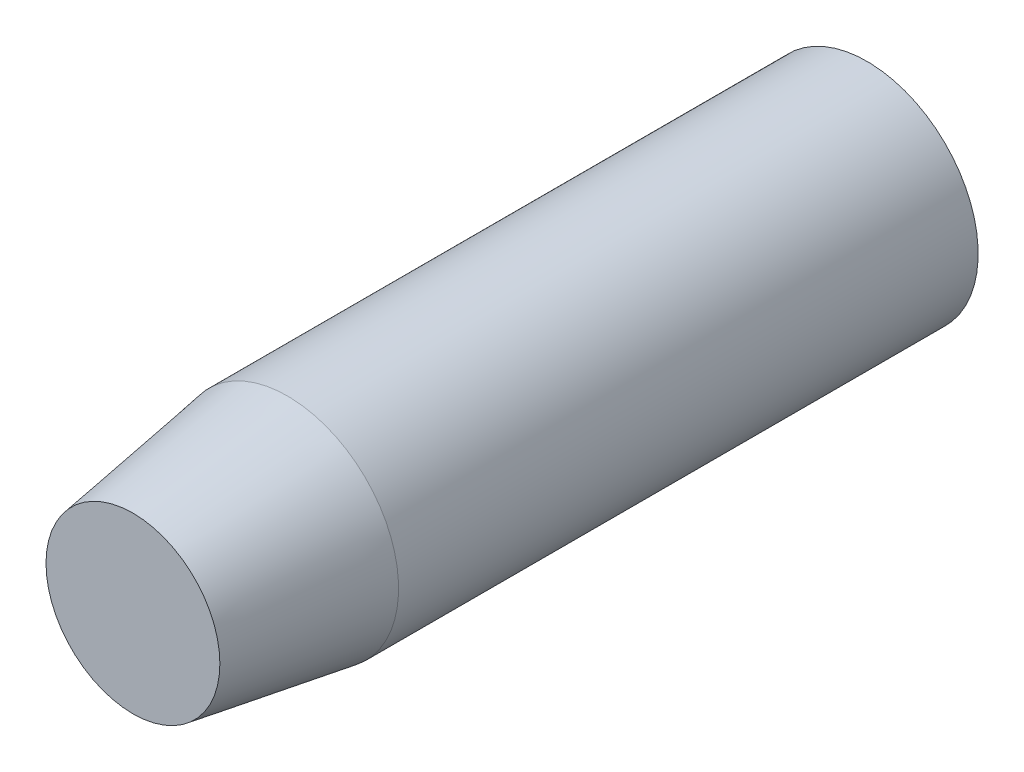
ISO-10303-21;
HEADER;
FILE_DESCRIPTION(('STEP AP214'),'2;1');
FILE_NAME('part.step','',(''),(''),'','','');
FILE_SCHEMA(('AUTOMOTIVE_DESIGN { 1 0 10303 214 1 1 1 1 }'));
ENDSEC;
DATA;
#1=APPLICATION_CONTEXT('core data for automotive mechanical design processes');
#2=APPLICATION_PROTOCOL_DEFINITION('international standard','automotive_design',2000,#1);
#3=PRODUCT_CONTEXT('',#1,'mechanical');
#4=PRODUCT('Part','Part','',(#3));
#5=PRODUCT_RELATED_PRODUCT_CATEGORY('part','',(#4));
#6=PRODUCT_DEFINITION_FORMATION('','',#4);
#7=PRODUCT_DEFINITION_CONTEXT('part definition',#1,'design');
#8=PRODUCT_DEFINITION('design','',#6,#7);
#9=PRODUCT_DEFINITION_SHAPE('','',#8);
#10=(LENGTH_UNIT() NAMED_UNIT(*) SI_UNIT(.MILLI.,.METRE.));
#11=(NAMED_UNIT(*) PLANE_ANGLE_UNIT() SI_UNIT($,.RADIAN.));
#12=(NAMED_UNIT(*) SI_UNIT($,.STERADIAN.) SOLID_ANGLE_UNIT());
#13=UNCERTAINTY_MEASURE_WITH_UNIT(LENGTH_MEASURE(1.E-05),#10,'distance_accuracy_value','');
#14=(GEOMETRIC_REPRESENTATION_CONTEXT(3) GLOBAL_UNCERTAINTY_ASSIGNED_CONTEXT((#13)) GLOBAL_UNIT_ASSIGNED_CONTEXT((#10,
#11,#12)) REPRESENTATION_CONTEXT('',''));
#15=CARTESIAN_POINT('',(0.,0.,0.));
#16=DIRECTION('',(0.,0.,1.));
#17=DIRECTION('',(1.,0.,0.));
#18=AXIS2_PLACEMENT_3D('',#15,#16,#17);
#19=CARTESIAN_POINT('',(0.,0.,60.325));
#20=DIRECTION('',(0.,0.,-1.));
#21=DIRECTION('',(-1.,0.,0.));
#22=AXIS2_PLACEMENT_3D('',#19,#20,#21);
#23=CYLINDRICAL_SURFACE('',#22,18.25625);
#24=CARTESIAN_POINT('',(0.,0.,34.9250000000015));
#25=DIRECTION('',(0.,0.,1.));
#26=DIRECTION('',(1.,0.,0.));
#27=AXIS2_PLACEMENT_3D('',#24,#25,#26);
#28=CIRCLE('',#27,18.25625);
#29=CARTESIAN_POINT('',(-18.25625,0.,34.9250000000015));
#30=VERTEX_POINT('',#29);
#31=EDGE_CURVE('E10',#30,#30,#28,.F.);
#32=CARTESIAN_POINT('',(0.,0.,-60.325));
#33=DIRECTION('',(0.,0.,1.));
#34=DIRECTION('',(1.,0.,0.));
#35=AXIS2_PLACEMENT_3D('',#32,#33,#34);
#36=CIRCLE('',#35,18.25625);
#37=CARTESIAN_POINT('',(-18.25625,0.,-60.325));
#38=VERTEX_POINT('',#37);
#39=EDGE_CURVE('E43',#38,#38,#36,.T.);
#40=CARTESIAN_POINT('',(-18.25625,0.,34.9250000000015));
#41=CARTESIAN_POINT('',(-18.25625,0.,33.9328125000014));
#42=CARTESIAN_POINT('',(-18.25625,0.,32.9406250000014));
#43=CARTESIAN_POINT('',(-18.25625,0.,30.9562500000014));
#44=CARTESIAN_POINT('',(-18.25625,0.,29.9640625000014));
#45=CARTESIAN_POINT('',(-18.25625,0.,27.9796875000014));
#46=CARTESIAN_POINT('',(-18.25625,0.,26.9875000000013));
#47=CARTESIAN_POINT('',(-18.25625,0.,25.0031250000013));
#48=CARTESIAN_POINT('',(-18.25625,0.,24.0109375000013));
#49=CARTESIAN_POINT('',(-18.25625,0.,22.0265625000013));
#50=CARTESIAN_POINT('',(-18.25625,0.,21.0343750000013));
#51=CARTESIAN_POINT('',(-18.25625,0.,19.0500000000012));
#52=CARTESIAN_POINT('',(-18.25625,0.,18.0578125000012));
#53=CARTESIAN_POINT('',(-18.25625,0.,16.0734375000012));
#54=CARTESIAN_POINT('',(-18.25625,0.,15.0812500000012));
#55=CARTESIAN_POINT('',(-18.25625,0.,13.0968750000011));
#56=CARTESIAN_POINT('',(-18.25625,0.,12.1046875000011));
#57=CARTESIAN_POINT('',(-18.25625,0.,10.1203125000011));
#58=CARTESIAN_POINT('',(-18.25625,0.,9.12812500000107));
#59=CARTESIAN_POINT('',(-18.25625,0.,7.14375000000104));
#60=CARTESIAN_POINT('',(-18.25625,0.,6.15156250000102));
#61=CARTESIAN_POINT('',(-18.25625,0.,4.16718750000099));
#62=CARTESIAN_POINT('',(-18.25625,0.,3.17500000000098));
#63=CARTESIAN_POINT('',(-18.25625,0.,1.19062500000095));
#64=CARTESIAN_POINT('',(-18.25625,0.,0.198437500000935));
#65=CARTESIAN_POINT('',(-18.25625,0.,-1.7859374999991));
#66=CARTESIAN_POINT('',(-18.25625,0.,-2.77812499999911));
#67=CARTESIAN_POINT('',(-18.25625,0.,-4.76249999999914));
#68=CARTESIAN_POINT('',(-18.25625,0.,-5.75468749999915));
#69=CARTESIAN_POINT('',(-18.25625,0.,-7.73906249999918));
#70=CARTESIAN_POINT('',(-18.25625,0.,-8.7312499999992));
#71=CARTESIAN_POINT('',(-18.25625,0.,-10.7156249999992));
#72=CARTESIAN_POINT('',(-18.25625,0.,-11.7078124999992));
#73=CARTESIAN_POINT('',(-18.25625,0.,-13.6921874999993));
#74=CARTESIAN_POINT('',(-18.25625,0.,-14.6843749999993));
#75=CARTESIAN_POINT('',(-18.25625,0.,-16.6687499999993));
#76=CARTESIAN_POINT('',(-18.25625,0.,-17.6609374999993));
#77=CARTESIAN_POINT('',(-18.25625,0.,-19.6453124999994));
#78=CARTESIAN_POINT('',(-18.25625,0.,-20.6374999999994));
#79=CARTESIAN_POINT('',(-18.25625,0.,-22.6218749999994));
#80=CARTESIAN_POINT('',(-18.25625,0.,-23.6140624999994));
#81=CARTESIAN_POINT('',(-18.25625,0.,-25.5984374999995));
#82=CARTESIAN_POINT('',(-18.25625,0.,-26.5906249999995));
#83=CARTESIAN_POINT('',(-18.25625,0.,-28.5749999999995));
#84=CARTESIAN_POINT('',(-18.25625,0.,-29.5671874999995));
#85=CARTESIAN_POINT('',(-18.25625,0.,-31.5515624999995));
#86=CARTESIAN_POINT('',(-18.25625,0.,-32.5437499999996));
#87=CARTESIAN_POINT('',(-18.25625,0.,-34.5281249999996));
#88=CARTESIAN_POINT('',(-18.25625,0.,-35.5203124999996));
#89=CARTESIAN_POINT('',(-18.25625,0.,-37.5046874999996));
#90=CARTESIAN_POINT('',(-18.25625,0.,-38.4968749999997));
#91=CARTESIAN_POINT('',(-18.25625,0.,-40.4812499999997));
#92=CARTESIAN_POINT('',(-18.25625,0.,-41.4734374999997));
#93=CARTESIAN_POINT('',(-18.25625,0.,-43.4578124999997));
#94=CARTESIAN_POINT('',(-18.25625,0.,-44.4499999999998));
#95=CARTESIAN_POINT('',(-18.25625,0.,-46.4343749999998));
#96=CARTESIAN_POINT('',(-18.25625,0.,-47.4265624999998));
#97=CARTESIAN_POINT('',(-18.25625,0.,-49.4109374999998));
#98=CARTESIAN_POINT('',(-18.25625,0.,-50.4031249999998));
#99=CARTESIAN_POINT('',(-18.25625,0.,-52.3874999999999));
#100=CARTESIAN_POINT('',(-18.25625,0.,-53.3796874999999));
#101=CARTESIAN_POINT('',(-18.25625,0.,-55.3640624999999));
#102=CARTESIAN_POINT('',(-18.25625,0.,-56.3562499999999));
#103=CARTESIAN_POINT('',(-18.25625,0.,-58.340625));
#104=CARTESIAN_POINT('',(-18.25625,0.,-59.3328125));
#105=CARTESIAN_POINT('',(-18.25625,0.,-60.325));
#106=B_SPLINE_CURVE_WITH_KNOTS('',3,(#40,#41,#42,#43,#44,#45,#46,#47,#48,#49,#50,#51,#52,#53,
#54,#55,#56,#57,#58,#59,#60,#61,#62,#63,#64,#65,#66,#67,#68,#69,#70,#71,#72,#73,#74,#75,#76,#77,
#78,#79,#80,#81,#82,#83,#84,#85,#86,#87,#88,#89,#90,#91,#92,#93,#94,#95,#96,#97,#98,#99,#100,
#101,#102,#103,#104,#105),.UNSPECIFIED.,.F.,.F.,(4,2,2,2,2,2,2,2,2,2,2,2,2,2,2,2,2,2,2,2,2,2,2,
2,2,2,2,2,2,2,2,2,4),(0.,2.97656250000005,5.95312500000009,8.92968750000014,11.9062500000002,
14.8828125000002,17.8593750000003,20.8359375000003,23.8125000000004,26.7890625000004,
29.7656250000005,32.7421875000005,35.7187500000005,38.6953125000006,41.6718750000006,
44.6484375000007,47.6250000000007,50.6015625000008,53.5781250000008,56.5546875000009,
59.5312500000009,62.507812500001,65.484375000001,68.460937500001,71.4375000000011,
74.4140625000011,77.3906250000012,80.3671875000012,83.3437500000013,86.3203125000013,
89.2968750000014,92.2734375000014,95.2500000000015),.UNSPECIFIED.);
#107=EDGE_CURVE('BSEAM32',#30,#38,#106,.T.);
#108=ORIENTED_EDGE('',*,*,#31,.T.);
#109=ORIENTED_EDGE('',*,*,#39,.T.);
#110=ORIENTED_EDGE('',*,*,#107,.T.);
#111=ORIENTED_EDGE('',*,*,#107,.F.);
#112=EDGE_LOOP('',(#108,#110,#109,#111));
#113=FACE_BOUND('',#112,.T.);
#114=ADVANCED_FACE('F32',(#113),#23,.T.);
#115=CARTESIAN_POINT('',(0.,0.,60.325));
#116=DIRECTION('',(0.,0.,1.));
#117=DIRECTION('',(1.,0.,0.));
#118=AXIS2_PLACEMENT_3D('',#115,#116,#117);
#119=PLANE('',#118);
#120=CARTESIAN_POINT('',(0.,0.,60.325));
#121=DIRECTION('',(0.,0.,1.));
#122=DIRECTION('',(1.,0.,0.));
#123=AXIS2_PLACEMENT_3D('',#120,#121,#122);
#124=CIRCLE('',#123,14.2875000000003);
#125=CARTESIAN_POINT('',(-14.2875000000003,0.,60.325));
#126=VERTEX_POINT('',#125);
#127=EDGE_CURVE('E39',#126,#126,#124,.T.);
#128=ORIENTED_EDGE('',*,*,#127,.T.);
#129=EDGE_LOOP('',(#128));
#130=FACE_BOUND('',#129,.T.);
#131=ADVANCED_FACE('F53',(#130),#119,.T.);
#132=CARTESIAN_POINT('',(0.,0.,-60.325));
#133=DIRECTION('',(0.,0.,1.));
#134=DIRECTION('',(1.,0.,0.));
#135=AXIS2_PLACEMENT_3D('',#132,#133,#134);
#136=PLANE('',#135);
#137=ORIENTED_EDGE('',*,*,#39,.F.);
#138=EDGE_LOOP('',(#137));
#139=FACE_BOUND('',#138,.T.);
#140=ADVANCED_FACE('F51',(#139),#136,.F.);
#141=CARTESIAN_POINT('',(0.,0.,60.325));
#142=DIRECTION('',(0.,0.,-1.));
#143=DIRECTION('',(-1.,0.,0.));
#144=AXIS2_PLACEMENT_3D('',#141,#142,#143);
#145=CONICAL_SURFACE('',#144,14.2875000000003,0.154996741923938);
#146=CARTESIAN_POINT('',(-18.25625,0.,34.9250000000015));
#147=CARTESIAN_POINT('',(-18.2149088541667,0.,35.1895833333348));
#148=CARTESIAN_POINT('',(-18.1735677083333,0.,35.4541666666681));
#149=CARTESIAN_POINT('',(-18.0908854166667,0.,35.9833333333347));
#150=CARTESIAN_POINT('',(-18.0495442708334,0.,36.2479166666681));
#151=CARTESIAN_POINT('',(-17.9668619791667,0.,36.7770833333347));
#152=CARTESIAN_POINT('',(-17.9255208333334,0.,37.041666666668));
#153=CARTESIAN_POINT('',(-17.8428385416667,0.,37.5708333333346));
#154=CARTESIAN_POINT('',(-17.8014973958334,0.,37.835416666668));
#155=CARTESIAN_POINT('',(-17.7188151041667,0.,38.3645833333346));
#156=CARTESIAN_POINT('',(-17.6774739583334,0.,38.6291666666679));
#157=CARTESIAN_POINT('',(-17.5947916666667,0.,39.1583333333346));
#158=CARTESIAN_POINT('',(-17.5534505208334,0.,39.4229166666679));
#159=CARTESIAN_POINT('',(-17.4707682291667,0.,39.9520833333345));
#160=CARTESIAN_POINT('',(-17.4294270833334,0.,40.2166666666678));
#161=CARTESIAN_POINT('',(-17.3467447916667,0.,40.7458333333345));
#162=CARTESIAN_POINT('',(-17.3054036458334,0.,41.0104166666678));
#163=CARTESIAN_POINT('',(-17.2227213541668,0.,41.5395833333344));
#164=CARTESIAN_POINT('',(-17.1813802083334,0.,41.8041666666677));
#165=CARTESIAN_POINT('',(-17.0986979166668,0.,42.3333333333344));
#166=CARTESIAN_POINT('',(-17.0573567708334,0.,42.5979166666677));
#167=CARTESIAN_POINT('',(-16.9746744791668,0.,43.1270833333343));
#168=CARTESIAN_POINT('',(-16.9333333333334,0.,43.3916666666676));
#169=CARTESIAN_POINT('',(-16.8506510416668,0.,43.9208333333343));
#170=CARTESIAN_POINT('',(-16.8093098958335,0.,44.1854166666676));
#171=CARTESIAN_POINT('',(-16.7266276041668,0.,44.7145833333342));
#172=CARTESIAN_POINT('',(-16.6852864583335,0.,44.9791666666675));
#173=CARTESIAN_POINT('',(-16.6026041666668,0.,45.5083333333342));
#174=CARTESIAN_POINT('',(-16.5612630208335,0.,45.7729166666675));
#175=CARTESIAN_POINT('',(-16.4785807291668,0.,46.3020833333341));
#176=CARTESIAN_POINT('',(-16.4372395833335,0.,46.5666666666675));
#177=CARTESIAN_POINT('',(-16.3545572916668,0.,47.0958333333341));
#178=CARTESIAN_POINT('',(-16.3132161458335,0.,47.3604166666674));
#179=CARTESIAN_POINT('',(-16.2305338541668,0.,47.889583333334));
#180=CARTESIAN_POINT('',(-16.1891927083335,0.,48.1541666666674));
#181=CARTESIAN_POINT('',(-16.1065104166668,0.,48.683333333334));
#182=CARTESIAN_POINT('',(-16.0651692708335,0.,48.9479166666673));
#183=CARTESIAN_POINT('',(-15.9824869791668,0.,49.477083333334));
#184=CARTESIAN_POINT('',(-15.9411458333335,0.,49.7416666666673));
#185=CARTESIAN_POINT('',(-15.8584635416669,0.,50.2708333333339));
#186=CARTESIAN_POINT('',(-15.8171223958335,0.,50.5354166666672));
#187=CARTESIAN_POINT('',(-15.7344401041669,0.,51.0645833333339));
#188=CARTESIAN_POINT('',(-15.6930989583335,0.,51.3291666666672));
#189=CARTESIAN_POINT('',(-15.6104166666669,0.,51.8583333333338));
#190=CARTESIAN_POINT('',(-15.5690755208336,0.,52.1229166666671));
#191=CARTESIAN_POINT('',(-15.4863932291669,0.,52.6520833333338));
#192=CARTESIAN_POINT('',(-15.4450520833336,0.,52.9166666666671));
#193=CARTESIAN_POINT('',(-15.3623697916669,0.,53.4458333333337));
#194=CARTESIAN_POINT('',(-15.3210286458336,0.,53.710416666667));
#195=CARTESIAN_POINT('',(-15.2383463541669,0.,54.2395833333337));
#196=CARTESIAN_POINT('',(-15.1970052083336,0.,54.504166666667));
#197=CARTESIAN_POINT('',(-15.1143229166669,0.,55.0333333333336));
#198=CARTESIAN_POINT('',(-15.0729817708336,0.,55.2979166666669));
#199=CARTESIAN_POINT('',(-14.9902994791669,0.,55.8270833333336));
#200=CARTESIAN_POINT('',(-14.9489583333336,0.,56.0916666666669));
#201=CARTESIAN_POINT('',(-14.8662760416669,0.,56.6208333333335));
#202=CARTESIAN_POINT('',(-14.8249348958336,0.,56.8854166666669));
#203=CARTESIAN_POINT('',(-14.742252604167,0.,57.4145833333335));
#204=CARTESIAN_POINT('',(-14.7009114583336,0.,57.6791666666668));
#205=CARTESIAN_POINT('',(-14.618229166667,0.,58.2083333333334));
#206=CARTESIAN_POINT('',(-14.5768880208336,0.,58.4729166666668));
#207=CARTESIAN_POINT('',(-14.494205729167,0.,59.0020833333334));
#208=CARTESIAN_POINT('',(-14.4528645833336,0.,59.2666666666667));
#209=CARTESIAN_POINT('',(-14.370182291667,0.,59.7958333333334));
#210=CARTESIAN_POINT('',(-14.3288411458337,0.,60.0604166666667));
#211=CARTESIAN_POINT('',(-14.2875000000003,0.,60.325));
#212=B_SPLINE_CURVE_WITH_KNOTS('',3,(#146,#147,#148,#149,#150,#151,#152,#153,#154,#155,#156,
#157,#158,#159,#160,#161,#162,#163,#164,#165,#166,#167,#168,#169,#170,#171,#172,#173,#174,#175,
#176,#177,#178,#179,#180,#181,#182,#183,#184,#185,#186,#187,#188,#189,#190,#191,#192,#193,#194,
#195,#196,#197,#198,#199,#200,#201,#202,#203,#204,#205,#206,#207,#208,#209,#210,#211),
.UNSPECIFIED.,.F.,.F.,(4,2,2,2,2,2,2,2,2,2,2,2,2,2,2,2,2,2,2,2,2,2,2,2,2,2,2,2,2,2,2,2,4),(0.,
0.803380903151949,1.6067618063039,2.41014270945585,3.2135236126078,4.01690451575975,
4.82028541891169,5.62366632206364,6.42704722521559,7.23042812836754,8.03380903151949,
8.83718993467144,9.64057083782339,10.4439517409753,11.2473326441273,12.0507135472792,
12.8540944504312,13.6574753535831,14.4608562567351,15.264237159887,16.067618063039,
16.8709989661909,17.6743798693429,18.4777607724948,19.2811416756468,20.0845225787987,
20.8879034819507,21.6912843851026,22.4946652882546,23.2980461914065,24.1014270945585,
24.9048079977104,25.7081889008623),.UNSPECIFIED.);
#213=EDGE_CURVE('BSEAM34',#30,#126,#212,.T.);
#214=ORIENTED_EDGE('',*,*,#31,.F.);
#215=ORIENTED_EDGE('',*,*,#127,.F.);
#216=ORIENTED_EDGE('',*,*,#213,.T.);
#217=ORIENTED_EDGE('',*,*,#213,.F.);
#218=EDGE_LOOP('',(#214,#216,#215,#217));
#219=FACE_BOUND('',#218,.T.);
#220=ADVANCED_FACE('F34',(#219),#145,.T.);
#221=CLOSED_SHELL('',(#114,#131,#140,#220));
#222=MANIFOLD_SOLID_BREP('B2',#221);
#223=ADVANCED_BREP_SHAPE_REPRESENTATION('',(#18,#222),#14);
#224=SHAPE_DEFINITION_REPRESENTATION(#9,#223);
ENDSEC;
END-ISO-10303-21;
